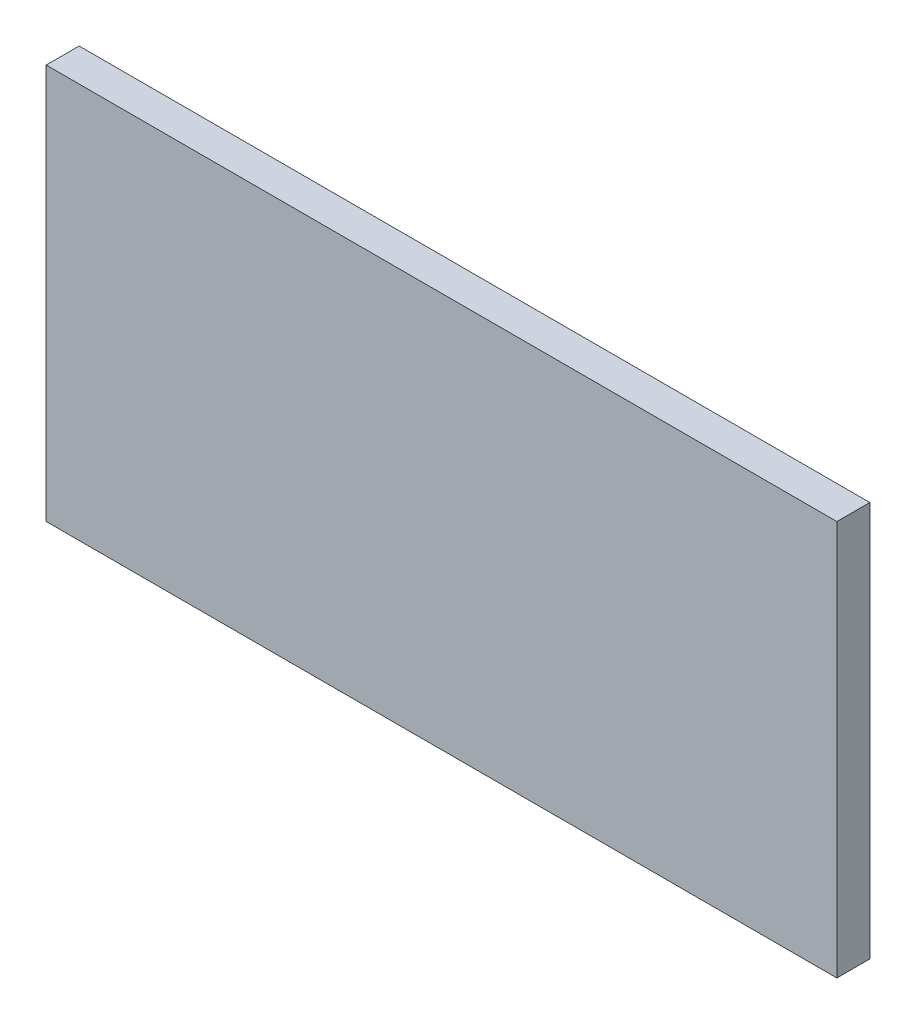
ISO-10303-21;
HEADER;
FILE_DESCRIPTION(('STEP AP214'),'2;1');
FILE_NAME('part.step','',(''),(''),'','','');
FILE_SCHEMA(('AUTOMOTIVE_DESIGN { 1 0 10303 214 1 1 1 1 }'));
ENDSEC;
DATA;
#1=APPLICATION_CONTEXT('core data for automotive mechanical design processes');
#2=APPLICATION_PROTOCOL_DEFINITION('international standard','automotive_design',2000,#1);
#3=PRODUCT_CONTEXT('',#1,'mechanical');
#4=PRODUCT('Part','Part','',(#3));
#5=PRODUCT_RELATED_PRODUCT_CATEGORY('part','',(#4));
#6=PRODUCT_DEFINITION_FORMATION('','',#4);
#7=PRODUCT_DEFINITION_CONTEXT('part definition',#1,'design');
#8=PRODUCT_DEFINITION('design','',#6,#7);
#9=PRODUCT_DEFINITION_SHAPE('','',#8);
#10=(LENGTH_UNIT() NAMED_UNIT(*) SI_UNIT(.MILLI.,.METRE.));
#11=(NAMED_UNIT(*) PLANE_ANGLE_UNIT() SI_UNIT($,.RADIAN.));
#12=(NAMED_UNIT(*) SI_UNIT($,.STERADIAN.) SOLID_ANGLE_UNIT());
#13=UNCERTAINTY_MEASURE_WITH_UNIT(LENGTH_MEASURE(1.E-05),#10,'distance_accuracy_value','');
#14=(GEOMETRIC_REPRESENTATION_CONTEXT(3) GLOBAL_UNCERTAINTY_ASSIGNED_CONTEXT((#13)) GLOBAL_UNIT_ASSIGNED_CONTEXT((#10,
#11,#12)) REPRESENTATION_CONTEXT('',''));
#15=CARTESIAN_POINT('',(0.,0.,0.));
#16=DIRECTION('',(0.,0.,1.));
#17=DIRECTION('',(1.,0.,0.));
#18=AXIS2_PLACEMENT_3D('',#15,#16,#17);
#19=CARTESIAN_POINT('',(0.,0.,5.));
#20=DIRECTION('',(1.,0.,0.));
#21=DIRECTION('',(0.,0.,-1.));
#22=AXIS2_PLACEMENT_3D('',#19,#20,#21);
#23=PLANE('',#22);
#24=DIRECTION('',(0.,-1.,0.));
#25=VECTOR('',#24,1.);
#26=CARTESIAN_POINT('',(0.,0.,0.));
#27=LINE('',#26,#25);
#28=CARTESIAN_POINT('',(0.,0.,0.));
#29=VERTEX_POINT('',#28);
#30=CARTESIAN_POINT('',(0.,-60.,0.));
#31=VERTEX_POINT('',#30);
#32=EDGE_CURVE('E107',#29,#31,#27,.T.);
#33=ORIENTED_EDGE('',*,*,#32,.T.);
#34=DIRECTION('',(0.,0.,-1.));
#35=VECTOR('',#34,1.);
#36=CARTESIAN_POINT('',(0.,-60.,5.));
#37=LINE('',#36,#35);
#38=CARTESIAN_POINT('',(0.,-60.,5.));
#39=VERTEX_POINT('',#38);
#40=EDGE_CURVE('E11',#39,#31,#37,.T.);
#41=ORIENTED_EDGE('',*,*,#40,.F.);
#42=DIRECTION('',(0.,-1.,0.));
#43=VECTOR('',#42,1.);
#44=CARTESIAN_POINT('',(0.,0.,5.));
#45=LINE('',#44,#43);
#46=CARTESIAN_POINT('',(0.,0.,5.));
#47=VERTEX_POINT('',#46);
#48=EDGE_CURVE('E91',#47,#39,#45,.T.);
#49=ORIENTED_EDGE('',*,*,#48,.F.);
#50=DIRECTION('',(0.,0.,-1.));
#51=VECTOR('',#50,1.);
#52=CARTESIAN_POINT('',(0.,0.,5.));
#53=LINE('',#52,#51);
#54=EDGE_CURVE('E103',#47,#29,#53,.T.);
#55=ORIENTED_EDGE('',*,*,#54,.T.);
#56=EDGE_LOOP('',(#33,#41,#49,#55));
#57=FACE_BOUND('',#56,.T.);
#58=ADVANCED_FACE('F39',(#57),#23,.F.);
#59=CARTESIAN_POINT('',(0.,-60.,5.));
#60=DIRECTION('',(0.,1.,0.));
#61=DIRECTION('',(0.,0.,1.));
#62=AXIS2_PLACEMENT_3D('',#59,#60,#61);
#63=PLANE('',#62);
#64=DIRECTION('',(1.,0.,0.));
#65=VECTOR('',#64,1.);
#66=CARTESIAN_POINT('',(0.,-60.,0.));
#67=LINE('',#66,#65);
#68=CARTESIAN_POINT('',(120.,-60.,0.));
#69=VERTEX_POINT('',#68);
#70=EDGE_CURVE('E96',#31,#69,#67,.T.);
#71=ORIENTED_EDGE('',*,*,#70,.T.);
#72=DIRECTION('',(0.,0.,-1.));
#73=VECTOR('',#72,1.);
#74=CARTESIAN_POINT('',(120.,-60.,5.));
#75=LINE('',#74,#73);
#76=CARTESIAN_POINT('',(120.,-60.,5.));
#77=VERTEX_POINT('',#76);
#78=EDGE_CURVE('E48',#77,#69,#75,.T.);
#79=ORIENTED_EDGE('',*,*,#78,.F.);
#80=DIRECTION('',(1.,0.,0.));
#81=VECTOR('',#80,1.);
#82=CARTESIAN_POINT('',(0.,-60.,5.));
#83=LINE('',#82,#81);
#84=EDGE_CURVE('E86',#39,#77,#83,.T.);
#85=ORIENTED_EDGE('',*,*,#84,.F.);
#86=ORIENTED_EDGE('',*,*,#40,.T.);
#87=EDGE_LOOP('',(#71,#79,#85,#86));
#88=FACE_BOUND('',#87,.T.);
#89=ADVANCED_FACE('F95',(#88),#63,.F.);
#90=CARTESIAN_POINT('',(120.,0.,5.));
#91=DIRECTION('',(-1.,0.,0.));
#92=DIRECTION('',(0.,-1.,0.));
#93=AXIS2_PLACEMENT_3D('',#90,#91,#92);
#94=PLANE('',#93);
#95=DIRECTION('',(0.,1.,0.));
#96=VECTOR('',#95,1.);
#97=CARTESIAN_POINT('',(120.,0.,0.));
#98=LINE('',#97,#96);
#99=CARTESIAN_POINT('',(120.,0.,0.));
#100=VERTEX_POINT('',#99);
#101=EDGE_CURVE('E73',#69,#100,#98,.T.);
#102=ORIENTED_EDGE('',*,*,#101,.T.);
#103=DIRECTION('',(0.,0.,-1.));
#104=VECTOR('',#103,1.);
#105=CARTESIAN_POINT('',(120.,0.,5.));
#106=LINE('',#105,#104);
#107=CARTESIAN_POINT('',(120.,0.,5.));
#108=VERTEX_POINT('',#107);
#109=EDGE_CURVE('E98',#108,#100,#106,.T.);
#110=ORIENTED_EDGE('',*,*,#109,.F.);
#111=DIRECTION('',(0.,1.,0.));
#112=VECTOR('',#111,1.);
#113=CARTESIAN_POINT('',(120.,0.,5.));
#114=LINE('',#113,#112);
#115=EDGE_CURVE('E89',#77,#108,#114,.T.);
#116=ORIENTED_EDGE('',*,*,#115,.F.);
#117=ORIENTED_EDGE('',*,*,#78,.T.);
#118=EDGE_LOOP('',(#102,#110,#116,#117));
#119=FACE_BOUND('',#118,.T.);
#120=ADVANCED_FACE('F99',(#119),#94,.F.);
#121=CARTESIAN_POINT('',(0.,0.,5.));
#122=DIRECTION('',(0.,-1.,0.));
#123=DIRECTION('',(0.,0.,-1.));
#124=AXIS2_PLACEMENT_3D('',#121,#122,#123);
#125=PLANE('',#124);
#126=DIRECTION('',(-1.,0.,0.));
#127=VECTOR('',#126,1.);
#128=CARTESIAN_POINT('',(0.,0.,0.));
#129=LINE('',#128,#127);
#130=EDGE_CURVE('E79',#100,#29,#129,.T.);
#131=ORIENTED_EDGE('',*,*,#130,.T.);
#132=ORIENTED_EDGE('',*,*,#54,.F.);
#133=DIRECTION('',(-1.,0.,0.));
#134=VECTOR('',#133,1.);
#135=CARTESIAN_POINT('',(0.,0.,5.));
#136=LINE('',#135,#134);
#137=EDGE_CURVE('E56',#108,#47,#136,.T.);
#138=ORIENTED_EDGE('',*,*,#137,.F.);
#139=ORIENTED_EDGE('',*,*,#109,.T.);
#140=EDGE_LOOP('',(#131,#132,#138,#139));
#141=FACE_BOUND('',#140,.T.);
#142=ADVANCED_FACE('F120',(#141),#125,.F.);
#143=CARTESIAN_POINT('',(0.,0.,5.));
#144=DIRECTION('',(0.,0.,1.));
#145=DIRECTION('',(1.,0.,0.));
#146=AXIS2_PLACEMENT_3D('',#143,#144,#145);
#147=PLANE('',#146);
#148=ORIENTED_EDGE('',*,*,#48,.T.);
#149=ORIENTED_EDGE('',*,*,#84,.T.);
#150=ORIENTED_EDGE('',*,*,#115,.T.);
#151=ORIENTED_EDGE('',*,*,#137,.T.);
#152=EDGE_LOOP('',(#148,#149,#150,#151));
#153=FACE_BOUND('',#152,.T.);
#154=ADVANCED_FACE('F87',(#153),#147,.T.);
#155=CARTESIAN_POINT('',(0.,0.,0.));
#156=DIRECTION('',(0.,0.,1.));
#157=DIRECTION('',(1.,0.,0.));
#158=AXIS2_PLACEMENT_3D('',#155,#156,#157);
#159=PLANE('',#158);
#160=ORIENTED_EDGE('',*,*,#32,.F.);
#161=ORIENTED_EDGE('',*,*,#130,.F.);
#162=ORIENTED_EDGE('',*,*,#101,.F.);
#163=ORIENTED_EDGE('',*,*,#70,.F.);
#164=EDGE_LOOP('',(#160,#161,#162,#163));
#165=FACE_BOUND('',#164,.T.);
#166=ADVANCED_FACE('F123',(#165),#159,.F.);
#167=CLOSED_SHELL('',(#58,#89,#120,#142,#154,#166));
#168=MANIFOLD_SOLID_BREP('B2',#167);
#169=ADVANCED_BREP_SHAPE_REPRESENTATION('',(#18,#168),#14);
#170=SHAPE_DEFINITION_REPRESENTATION(#9,#169);
ENDSEC;
END-ISO-10303-21;
